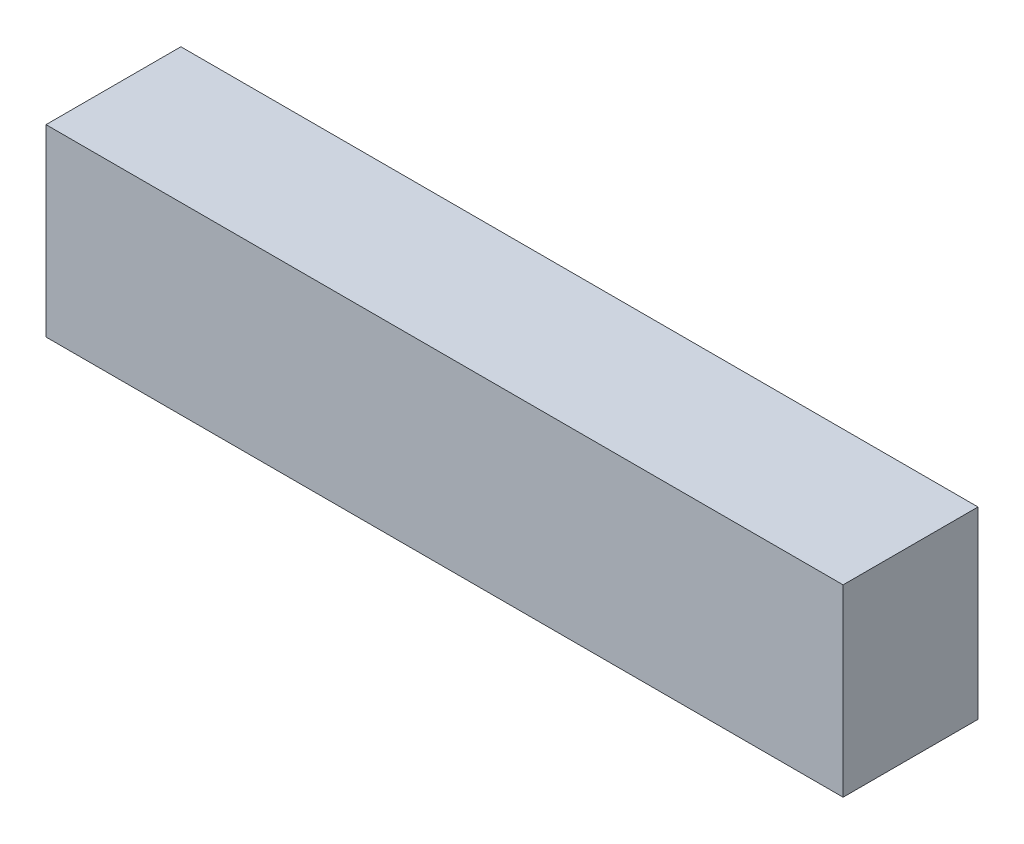
ISO-10303-21;
HEADER;
FILE_DESCRIPTION(('STEP AP214'),'2;1');
FILE_NAME('part.step','',(''),(''),'','','');
FILE_SCHEMA(('AUTOMOTIVE_DESIGN { 1 0 10303 214 1 1 1 1 }'));
ENDSEC;
DATA;
#1=APPLICATION_CONTEXT('core data for automotive mechanical design processes');
#2=APPLICATION_PROTOCOL_DEFINITION('international standard','automotive_design',2000,#1);
#3=PRODUCT_CONTEXT('',#1,'mechanical');
#4=PRODUCT('Part','Part','',(#3));
#5=PRODUCT_RELATED_PRODUCT_CATEGORY('part','',(#4));
#6=PRODUCT_DEFINITION_FORMATION('','',#4);
#7=PRODUCT_DEFINITION_CONTEXT('part definition',#1,'design');
#8=PRODUCT_DEFINITION('design','',#6,#7);
#9=PRODUCT_DEFINITION_SHAPE('','',#8);
#10=(LENGTH_UNIT() NAMED_UNIT(*) SI_UNIT(.MILLI.,.METRE.));
#11=(NAMED_UNIT(*) PLANE_ANGLE_UNIT() SI_UNIT($,.RADIAN.));
#12=(NAMED_UNIT(*) SI_UNIT($,.STERADIAN.) SOLID_ANGLE_UNIT());
#13=UNCERTAINTY_MEASURE_WITH_UNIT(LENGTH_MEASURE(1.E-05),#10,'distance_accuracy_value','');
#14=(GEOMETRIC_REPRESENTATION_CONTEXT(3) GLOBAL_UNCERTAINTY_ASSIGNED_CONTEXT((#13)) GLOBAL_UNIT_ASSIGNED_CONTEXT((#10,
#11,#12)) REPRESENTATION_CONTEXT('',''));
#15=CARTESIAN_POINT('',(0.,0.,0.));
#16=DIRECTION('',(0.,0.,1.));
#17=DIRECTION('',(1.,0.,0.));
#18=AXIS2_PLACEMENT_3D('',#15,#16,#17);
#19=CARTESIAN_POINT('',(0.,30.,0.));
#20=DIRECTION('',(1.,0.,0.));
#21=DIRECTION('',(0.,0.,-1.));
#22=AXIS2_PLACEMENT_3D('',#19,#20,#21);
#23=PLANE('',#22);
#24=DIRECTION('',(0.,0.,1.));
#25=VECTOR('',#24,1.);
#26=CARTESIAN_POINT('',(0.,0.,0.));
#27=LINE('',#26,#25);
#28=CARTESIAN_POINT('',(0.,0.,-22.));
#29=VERTEX_POINT('',#28);
#30=CARTESIAN_POINT('',(0.,0.,0.));
#31=VERTEX_POINT('',#30);
#32=EDGE_CURVE('E113',#29,#31,#27,.T.);
#33=ORIENTED_EDGE('',*,*,#32,.T.);
#34=DIRECTION('',(0.,-1.,0.));
#35=VECTOR('',#34,1.);
#36=CARTESIAN_POINT('',(0.,30.,0.));
#37=LINE('',#36,#35);
#38=CARTESIAN_POINT('',(0.,30.,0.));
#39=VERTEX_POINT('',#38);
#40=EDGE_CURVE('E11',#39,#31,#37,.T.);
#41=ORIENTED_EDGE('',*,*,#40,.F.);
#42=DIRECTION('',(0.,0.,1.));
#43=VECTOR('',#42,1.);
#44=CARTESIAN_POINT('',(0.,30.,0.));
#45=LINE('',#44,#43);
#46=CARTESIAN_POINT('',(0.,30.,-22.));
#47=VERTEX_POINT('',#46);
#48=EDGE_CURVE('E97',#47,#39,#45,.T.);
#49=ORIENTED_EDGE('',*,*,#48,.F.);
#50=DIRECTION('',(0.,-1.,0.));
#51=VECTOR('',#50,1.);
#52=CARTESIAN_POINT('',(0.,30.,-22.));
#53=LINE('',#52,#51);
#54=EDGE_CURVE('E109',#47,#29,#53,.T.);
#55=ORIENTED_EDGE('',*,*,#54,.T.);
#56=EDGE_LOOP('',(#33,#41,#49,#55));
#57=FACE_BOUND('',#56,.T.);
#58=ADVANCED_FACE('F45',(#57),#23,.F.);
#59=CARTESIAN_POINT('',(0.,30.,0.));
#60=DIRECTION('',(0.,0.,-1.));
#61=DIRECTION('',(-1.,0.,0.));
#62=AXIS2_PLACEMENT_3D('',#59,#60,#61);
#63=PLANE('',#62);
#64=DIRECTION('',(1.,0.,0.));
#65=VECTOR('',#64,1.);
#66=CARTESIAN_POINT('',(0.,0.,0.));
#67=LINE('',#66,#65);
#68=CARTESIAN_POINT('',(130.,0.,0.));
#69=VERTEX_POINT('',#68);
#70=EDGE_CURVE('E102',#31,#69,#67,.T.);
#71=ORIENTED_EDGE('',*,*,#70,.T.);
#72=DIRECTION('',(0.,-1.,0.));
#73=VECTOR('',#72,1.);
#74=CARTESIAN_POINT('',(130.,30.,0.));
#75=LINE('',#74,#73);
#76=CARTESIAN_POINT('',(130.,30.,0.));
#77=VERTEX_POINT('',#76);
#78=EDGE_CURVE('E54',#77,#69,#75,.T.);
#79=ORIENTED_EDGE('',*,*,#78,.F.);
#80=DIRECTION('',(1.,0.,0.));
#81=VECTOR('',#80,1.);
#82=CARTESIAN_POINT('',(0.,30.,0.));
#83=LINE('',#82,#81);
#84=EDGE_CURVE('E92',#39,#77,#83,.T.);
#85=ORIENTED_EDGE('',*,*,#84,.F.);
#86=ORIENTED_EDGE('',*,*,#40,.T.);
#87=EDGE_LOOP('',(#71,#79,#85,#86));
#88=FACE_BOUND('',#87,.T.);
#89=ADVANCED_FACE('F101',(#88),#63,.F.);
#90=CARTESIAN_POINT('',(130.,30.,0.));
#91=DIRECTION('',(-1.,0.,0.));
#92=DIRECTION('',(0.,0.,1.));
#93=AXIS2_PLACEMENT_3D('',#90,#91,#92);
#94=PLANE('',#93);
#95=DIRECTION('',(0.,0.,-1.));
#96=VECTOR('',#95,1.);
#97=CARTESIAN_POINT('',(130.,0.,0.));
#98=LINE('',#97,#96);
#99=CARTESIAN_POINT('',(130.,0.,-22.));
#100=VERTEX_POINT('',#99);
#101=EDGE_CURVE('E79',#69,#100,#98,.T.);
#102=ORIENTED_EDGE('',*,*,#101,.T.);
#103=DIRECTION('',(0.,-1.,0.));
#104=VECTOR('',#103,1.);
#105=CARTESIAN_POINT('',(130.,30.,-22.));
#106=LINE('',#105,#104);
#107=CARTESIAN_POINT('',(130.,30.,-22.));
#108=VERTEX_POINT('',#107);
#109=EDGE_CURVE('E104',#108,#100,#106,.T.);
#110=ORIENTED_EDGE('',*,*,#109,.F.);
#111=DIRECTION('',(0.,0.,-1.));
#112=VECTOR('',#111,1.);
#113=CARTESIAN_POINT('',(130.,30.,0.));
#114=LINE('',#113,#112);
#115=EDGE_CURVE('E95',#77,#108,#114,.T.);
#116=ORIENTED_EDGE('',*,*,#115,.F.);
#117=ORIENTED_EDGE('',*,*,#78,.T.);
#118=EDGE_LOOP('',(#102,#110,#116,#117));
#119=FACE_BOUND('',#118,.T.);
#120=ADVANCED_FACE('F105',(#119),#94,.F.);
#121=CARTESIAN_POINT('',(0.,30.,-22.));
#122=DIRECTION('',(0.,0.,1.));
#123=DIRECTION('',(1.,0.,0.));
#124=AXIS2_PLACEMENT_3D('',#121,#122,#123);
#125=PLANE('',#124);
#126=DIRECTION('',(-1.,0.,0.));
#127=VECTOR('',#126,1.);
#128=CARTESIAN_POINT('',(0.,0.,-22.));
#129=LINE('',#128,#127);
#130=EDGE_CURVE('E85',#100,#29,#129,.T.);
#131=ORIENTED_EDGE('',*,*,#130,.T.);
#132=ORIENTED_EDGE('',*,*,#54,.F.);
#133=DIRECTION('',(-1.,0.,0.));
#134=VECTOR('',#133,1.);
#135=CARTESIAN_POINT('',(0.,30.,-22.));
#136=LINE('',#135,#134);
#137=EDGE_CURVE('E62',#108,#47,#136,.T.);
#138=ORIENTED_EDGE('',*,*,#137,.F.);
#139=ORIENTED_EDGE('',*,*,#109,.T.);
#140=EDGE_LOOP('',(#131,#132,#138,#139));
#141=FACE_BOUND('',#140,.T.);
#142=ADVANCED_FACE('F126',(#141),#125,.F.);
#143=CARTESIAN_POINT('',(0.,30.,0.));
#144=DIRECTION('',(0.,-1.,0.));
#145=DIRECTION('',(0.,0.,-1.));
#146=AXIS2_PLACEMENT_3D('',#143,#144,#145);
#147=PLANE('',#146);
#148=ORIENTED_EDGE('',*,*,#48,.T.);
#149=ORIENTED_EDGE('',*,*,#84,.T.);
#150=ORIENTED_EDGE('',*,*,#115,.T.);
#151=ORIENTED_EDGE('',*,*,#137,.T.);
#152=EDGE_LOOP('',(#148,#149,#150,#151));
#153=FACE_BOUND('',#152,.T.);
#154=ADVANCED_FACE('F93',(#153),#147,.F.);
#155=CARTESIAN_POINT('',(0.,0.,0.));
#156=DIRECTION('',(0.,-1.,0.));
#157=DIRECTION('',(0.,0.,-1.));
#158=AXIS2_PLACEMENT_3D('',#155,#156,#157);
#159=PLANE('',#158);
#160=ORIENTED_EDGE('',*,*,#32,.F.);
#161=ORIENTED_EDGE('',*,*,#130,.F.);
#162=ORIENTED_EDGE('',*,*,#101,.F.);
#163=ORIENTED_EDGE('',*,*,#70,.F.);
#164=EDGE_LOOP('',(#160,#161,#162,#163));
#165=FACE_BOUND('',#164,.T.);
#166=ADVANCED_FACE('F129',(#165),#159,.T.);
#167=CLOSED_SHELL('',(#58,#89,#120,#142,#154,#166));
#168=MANIFOLD_SOLID_BREP('B2',#167);
#169=ADVANCED_BREP_SHAPE_REPRESENTATION('',(#18,#168),#14);
#170=SHAPE_DEFINITION_REPRESENTATION(#9,#169);
ENDSEC;
END-ISO-10303-21;
